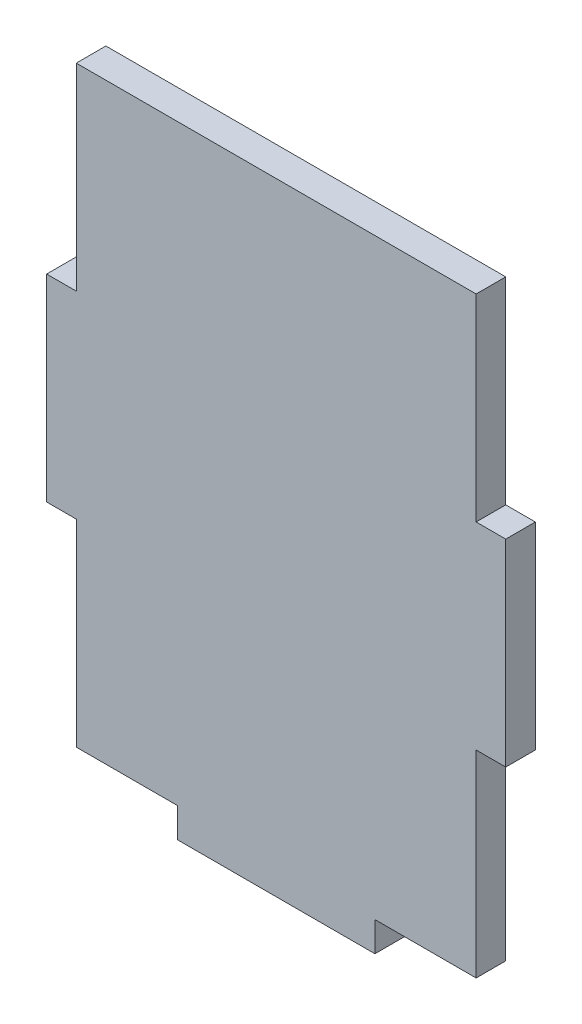
ISO-10303-21;
HEADER;
FILE_DESCRIPTION(('STEP AP214'),'2;1');
FILE_NAME('part.step','',(''),(''),'','','');
FILE_SCHEMA(('AUTOMOTIVE_DESIGN { 1 0 10303 214 1 1 1 1 }'));
ENDSEC;
DATA;
#1=APPLICATION_CONTEXT('core data for automotive mechanical design processes');
#2=APPLICATION_PROTOCOL_DEFINITION('international standard','automotive_design',2000,#1);
#3=PRODUCT_CONTEXT('',#1,'mechanical');
#4=PRODUCT('Part','Part','',(#3));
#5=PRODUCT_RELATED_PRODUCT_CATEGORY('part','',(#4));
#6=PRODUCT_DEFINITION_FORMATION('','',#4);
#7=PRODUCT_DEFINITION_CONTEXT('part definition',#1,'design');
#8=PRODUCT_DEFINITION('design','',#6,#7);
#9=PRODUCT_DEFINITION_SHAPE('','',#8);
#10=(LENGTH_UNIT() NAMED_UNIT(*) SI_UNIT(.MILLI.,.METRE.));
#11=(NAMED_UNIT(*) PLANE_ANGLE_UNIT() SI_UNIT($,.RADIAN.));
#12=(NAMED_UNIT(*) SI_UNIT($,.STERADIAN.) SOLID_ANGLE_UNIT());
#13=UNCERTAINTY_MEASURE_WITH_UNIT(LENGTH_MEASURE(1.E-05),#10,'distance_accuracy_value','');
#14=(GEOMETRIC_REPRESENTATION_CONTEXT(3) GLOBAL_UNCERTAINTY_ASSIGNED_CONTEXT((#13)) GLOBAL_UNIT_ASSIGNED_CONTEXT((#10,
#11,#12)) REPRESENTATION_CONTEXT('',''));
#15=CARTESIAN_POINT('',(0.,0.,0.));
#16=DIRECTION('',(0.,0.,1.));
#17=DIRECTION('',(1.,0.,0.));
#18=AXIS2_PLACEMENT_3D('',#15,#16,#17);
#19=CARTESIAN_POINT('',(0.,0.,3.));
#20=DIRECTION('',(-1.,0.,0.));
#21=DIRECTION('',(0.,0.,1.));
#22=AXIS2_PLACEMENT_3D('',#19,#20,#21);
#23=PLANE('',#22);
#24=DIRECTION('',(0.,0.,-1.));
#25=VECTOR('',#24,1.);
#26=CARTESIAN_POINT('',(0.,40.,3.));
#27=LINE('',#26,#25);
#28=CARTESIAN_POINT('',(0.,40.,3.));
#29=VERTEX_POINT('',#28);
#30=CARTESIAN_POINT('',(0.,40.,0.));
#31=VERTEX_POINT('',#30);
#32=EDGE_CURVE('E173',#29,#31,#27,.T.);
#33=ORIENTED_EDGE('',*,*,#32,.F.);
#34=DIRECTION('',(0.,1.,0.));
#35=VECTOR('',#34,1.);
#36=CARTESIAN_POINT('',(0.,0.,3.));
#37=LINE('',#36,#35);
#38=CARTESIAN_POINT('',(0.,60.,3.));
#39=VERTEX_POINT('',#38);
#40=EDGE_CURVE('E423',#29,#39,#37,.T.);
#41=ORIENTED_EDGE('',*,*,#40,.T.);
#42=DIRECTION('',(0.,0.,-1.));
#43=VECTOR('',#42,1.);
#44=CARTESIAN_POINT('',(0.,60.,3.));
#45=LINE('',#44,#43);
#46=CARTESIAN_POINT('',(0.,60.,0.));
#47=VERTEX_POINT('',#46);
#48=EDGE_CURVE('E254',#39,#47,#45,.T.);
#49=ORIENTED_EDGE('',*,*,#48,.T.);
#50=DIRECTION('',(0.,1.,0.));
#51=VECTOR('',#50,1.);
#52=CARTESIAN_POINT('',(0.,0.,0.));
#53=LINE('',#52,#51);
#54=EDGE_CURVE('E251',#31,#47,#53,.T.);
#55=ORIENTED_EDGE('',*,*,#54,.F.);
#56=EDGE_LOOP('',(#33,#41,#49,#55));
#57=FACE_BOUND('',#56,.T.);
#58=ADVANCED_FACE('F163',(#57),#23,.T.);
#59=CARTESIAN_POINT('',(0.,0.,3.));
#60=VERTEX_POINT('',#59);
#61=CARTESIAN_POINT('',(0.,20.,3.));
#62=VERTEX_POINT('',#61);
#63=EDGE_CURVE('E266',#60,#62,#37,.T.);
#64=ORIENTED_EDGE('',*,*,#63,.T.);
#65=DIRECTION('',(0.,0.,-1.));
#66=VECTOR('',#65,1.);
#67=CARTESIAN_POINT('',(0.,20.,3.));
#68=LINE('',#67,#66);
#69=CARTESIAN_POINT('',(0.,20.,0.));
#70=VERTEX_POINT('',#69);
#71=EDGE_CURVE('E12',#62,#70,#68,.T.);
#72=ORIENTED_EDGE('',*,*,#71,.T.);
#73=CARTESIAN_POINT('',(0.,0.,0.));
#74=VERTEX_POINT('',#73);
#75=EDGE_CURVE('E224',#74,#70,#53,.T.);
#76=ORIENTED_EDGE('',*,*,#75,.F.);
#77=DIRECTION('',(0.,0.,-1.));
#78=VECTOR('',#77,1.);
#79=CARTESIAN_POINT('',(0.,0.,3.));
#80=LINE('',#79,#78);
#81=EDGE_CURVE('E263',#60,#74,#80,.T.);
#82=ORIENTED_EDGE('',*,*,#81,.F.);
#83=EDGE_LOOP('',(#64,#72,#76,#82));
#84=FACE_BOUND('',#83,.T.);
#85=ADVANCED_FACE('F447',(#84),#23,.T.);
#86=CARTESIAN_POINT('',(40.5,0.,3.));
#87=DIRECTION('',(-1.,0.,0.));
#88=DIRECTION('',(0.,0.,1.));
#89=AXIS2_PLACEMENT_3D('',#86,#87,#88);
#90=PLANE('',#89);
#91=DIRECTION('',(0.,1.,0.));
#92=VECTOR('',#91,1.);
#93=CARTESIAN_POINT('',(40.5,0.,0.));
#94=LINE('',#93,#92);
#95=CARTESIAN_POINT('',(40.5,40.,0.));
#96=VERTEX_POINT('',#95);
#97=CARTESIAN_POINT('',(40.5,60.,0.));
#98=VERTEX_POINT('',#97);
#99=EDGE_CURVE('E259',#96,#98,#94,.T.);
#100=ORIENTED_EDGE('',*,*,#99,.T.);
#101=DIRECTION('',(0.,0.,-1.));
#102=VECTOR('',#101,1.);
#103=CARTESIAN_POINT('',(40.5,60.,3.));
#104=LINE('',#103,#102);
#105=CARTESIAN_POINT('',(40.5,60.,3.));
#106=VERTEX_POINT('',#105);
#107=EDGE_CURVE('E268',#106,#98,#104,.T.);
#108=ORIENTED_EDGE('',*,*,#107,.F.);
#109=DIRECTION('',(0.,1.,0.));
#110=VECTOR('',#109,1.);
#111=CARTESIAN_POINT('',(40.5,0.,3.));
#112=LINE('',#111,#110);
#113=CARTESIAN_POINT('',(40.5,40.,3.));
#114=VERTEX_POINT('',#113);
#115=EDGE_CURVE('E418',#114,#106,#112,.T.);
#116=ORIENTED_EDGE('',*,*,#115,.F.);
#117=DIRECTION('',(0.,0.,-1.));
#118=VECTOR('',#117,1.);
#119=CARTESIAN_POINT('',(40.5,40.,3.));
#120=LINE('',#119,#118);
#121=EDGE_CURVE('E271',#114,#96,#120,.T.);
#122=ORIENTED_EDGE('',*,*,#121,.T.);
#123=EDGE_LOOP('',(#100,#108,#116,#122));
#124=FACE_BOUND('',#123,.T.);
#125=ADVANCED_FACE('F339',(#124),#90,.F.);
#126=CARTESIAN_POINT('',(40.5,0.,0.));
#127=VERTEX_POINT('',#126);
#128=CARTESIAN_POINT('',(40.5,20.,0.));
#129=VERTEX_POINT('',#128);
#130=EDGE_CURVE('E318',#127,#129,#94,.T.);
#131=ORIENTED_EDGE('',*,*,#130,.T.);
#132=DIRECTION('',(0.,0.,-1.));
#133=VECTOR('',#132,1.);
#134=CARTESIAN_POINT('',(40.5,20.,3.));
#135=LINE('',#134,#133);
#136=CARTESIAN_POINT('',(40.5,20.,3.));
#137=VERTEX_POINT('',#136);
#138=EDGE_CURVE('E280',#137,#129,#135,.T.);
#139=ORIENTED_EDGE('',*,*,#138,.F.);
#140=CARTESIAN_POINT('',(40.5,0.,3.));
#141=VERTEX_POINT('',#140);
#142=EDGE_CURVE('E401',#141,#137,#112,.T.);
#143=ORIENTED_EDGE('',*,*,#142,.F.);
#144=DIRECTION('',(0.,0.,-1.));
#145=VECTOR('',#144,1.);
#146=CARTESIAN_POINT('',(40.5,0.,3.));
#147=LINE('',#146,#145);
#148=EDGE_CURVE('E283',#141,#127,#147,.T.);
#149=ORIENTED_EDGE('',*,*,#148,.T.);
#150=EDGE_LOOP('',(#131,#139,#143,#149));
#151=FACE_BOUND('',#150,.T.);
#152=ADVANCED_FACE('F398',(#151),#90,.F.);
#153=CARTESIAN_POINT('',(0.,0.,3.));
#154=DIRECTION('',(0.,1.,0.));
#155=DIRECTION('',(0.,0.,1.));
#156=AXIS2_PLACEMENT_3D('',#153,#154,#155);
#157=PLANE('',#156);
#158=DIRECTION('',(1.,0.,0.));
#159=VECTOR('',#158,1.);
#160=CARTESIAN_POINT('',(0.,0.,0.));
#161=LINE('',#160,#159);
#162=CARTESIAN_POINT('',(30.25,0.,0.));
#163=VERTEX_POINT('',#162);
#164=EDGE_CURVE('E316',#163,#127,#161,.T.);
#165=ORIENTED_EDGE('',*,*,#164,.T.);
#166=ORIENTED_EDGE('',*,*,#148,.F.);
#167=DIRECTION('',(1.,0.,0.));
#168=VECTOR('',#167,1.);
#169=CARTESIAN_POINT('',(0.,0.,3.));
#170=LINE('',#169,#168);
#171=CARTESIAN_POINT('',(30.25,0.,3.));
#172=VERTEX_POINT('',#171);
#173=EDGE_CURVE('E407',#172,#141,#170,.T.);
#174=ORIENTED_EDGE('',*,*,#173,.F.);
#175=DIRECTION('',(0.,0.,-1.));
#176=VECTOR('',#175,1.);
#177=CARTESIAN_POINT('',(30.25,0.,3.));
#178=LINE('',#177,#176);
#179=EDGE_CURVE('E286',#172,#163,#178,.T.);
#180=ORIENTED_EDGE('',*,*,#179,.T.);
#181=EDGE_LOOP('',(#165,#166,#174,#180));
#182=FACE_BOUND('',#181,.T.);
#183=ADVANCED_FACE('F404',(#182),#157,.F.);
#184=CARTESIAN_POINT('',(10.25,0.,0.));
#185=VERTEX_POINT('',#184);
#186=EDGE_CURVE('E320',#74,#185,#161,.T.);
#187=ORIENTED_EDGE('',*,*,#186,.T.);
#188=DIRECTION('',(0.,0.,-1.));
#189=VECTOR('',#188,1.);
#190=CARTESIAN_POINT('',(10.25,0.,3.));
#191=LINE('',#190,#189);
#192=CARTESIAN_POINT('',(10.25,0.,3.));
#193=VERTEX_POINT('',#192);
#194=EDGE_CURVE('E232',#193,#185,#191,.T.);
#195=ORIENTED_EDGE('',*,*,#194,.F.);
#196=EDGE_CURVE('E258',#60,#193,#170,.T.);
#197=ORIENTED_EDGE('',*,*,#196,.F.);
#198=ORIENTED_EDGE('',*,*,#81,.T.);
#199=EDGE_LOOP('',(#187,#195,#197,#198));
#200=FACE_BOUND('',#199,.T.);
#201=ADVANCED_FACE('F443',(#200),#157,.F.);
#202=CARTESIAN_POINT('',(0.,60.,3.));
#203=DIRECTION('',(0.,1.,0.));
#204=DIRECTION('',(0.,0.,1.));
#205=AXIS2_PLACEMENT_3D('',#202,#203,#204);
#206=PLANE('',#205);
#207=DIRECTION('',(1.,0.,0.));
#208=VECTOR('',#207,1.);
#209=CARTESIAN_POINT('',(0.,60.,0.));
#210=LINE('',#209,#208);
#211=EDGE_CURVE('E256',#47,#98,#210,.T.);
#212=ORIENTED_EDGE('',*,*,#211,.F.);
#213=ORIENTED_EDGE('',*,*,#48,.F.);
#214=DIRECTION('',(1.,0.,0.));
#215=VECTOR('',#214,1.);
#216=CARTESIAN_POINT('',(0.,60.,3.));
#217=LINE('',#216,#215);
#218=EDGE_CURVE('E421',#39,#106,#217,.T.);
#219=ORIENTED_EDGE('',*,*,#218,.T.);
#220=ORIENTED_EDGE('',*,*,#107,.T.);
#221=EDGE_LOOP('',(#212,#213,#219,#220));
#222=FACE_BOUND('',#221,.T.);
#223=ADVANCED_FACE('F347',(#222),#206,.T.);
#224=CARTESIAN_POINT('',(43.5,0.,3.));
#225=DIRECTION('',(1.,0.,0.));
#226=DIRECTION('',(0.,0.,-1.));
#227=AXIS2_PLACEMENT_3D('',#224,#225,#226);
#228=PLANE('',#227);
#229=DIRECTION('',(0.,-1.,0.));
#230=VECTOR('',#229,1.);
#231=CARTESIAN_POINT('',(43.5,0.,0.));
#232=LINE('',#231,#230);
#233=CARTESIAN_POINT('',(43.5,40.,0.));
#234=VERTEX_POINT('',#233);
#235=CARTESIAN_POINT('',(43.5,20.,0.));
#236=VERTEX_POINT('',#235);
#237=EDGE_CURVE('E328',#234,#236,#232,.T.);
#238=ORIENTED_EDGE('',*,*,#237,.F.);
#239=DIRECTION('',(0.,0.,-1.));
#240=VECTOR('',#239,1.);
#241=CARTESIAN_POINT('',(43.5,40.,3.));
#242=LINE('',#241,#240);
#243=CARTESIAN_POINT('',(43.5,40.,3.));
#244=VERTEX_POINT('',#243);
#245=EDGE_CURVE('E274',#244,#234,#242,.T.);
#246=ORIENTED_EDGE('',*,*,#245,.F.);
#247=DIRECTION('',(0.,-1.,0.));
#248=VECTOR('',#247,1.);
#249=CARTESIAN_POINT('',(43.5,0.,3.));
#250=LINE('',#249,#248);
#251=CARTESIAN_POINT('',(43.5,20.,3.));
#252=VERTEX_POINT('',#251);
#253=EDGE_CURVE('E425',#244,#252,#250,.T.);
#254=ORIENTED_EDGE('',*,*,#253,.T.);
#255=DIRECTION('',(0.,0.,-1.));
#256=VECTOR('',#255,1.);
#257=CARTESIAN_POINT('',(43.5,20.,3.));
#258=LINE('',#257,#256);
#259=EDGE_CURVE('E277',#252,#236,#258,.T.);
#260=ORIENTED_EDGE('',*,*,#259,.T.);
#261=EDGE_LOOP('',(#238,#246,#254,#260));
#262=FACE_BOUND('',#261,.T.);
#263=ADVANCED_FACE('F385',(#262),#228,.T.);
#264=CARTESIAN_POINT('',(0.,40.,3.));
#265=DIRECTION('',(0.,1.,0.));
#266=DIRECTION('',(0.,0.,1.));
#267=AXIS2_PLACEMENT_3D('',#264,#265,#266);
#268=PLANE('',#267);
#269=DIRECTION('',(1.,0.,0.));
#270=VECTOR('',#269,1.);
#271=CARTESIAN_POINT('',(0.,40.,0.));
#272=LINE('',#271,#270);
#273=EDGE_CURVE('E330',#96,#234,#272,.T.);
#274=ORIENTED_EDGE('',*,*,#273,.F.);
#275=ORIENTED_EDGE('',*,*,#121,.F.);
#276=DIRECTION('',(1.,0.,0.));
#277=VECTOR('',#276,1.);
#278=CARTESIAN_POINT('',(0.,40.,3.));
#279=LINE('',#278,#277);
#280=EDGE_CURVE('E381',#114,#244,#279,.T.);
#281=ORIENTED_EDGE('',*,*,#280,.T.);
#282=ORIENTED_EDGE('',*,*,#245,.T.);
#283=EDGE_LOOP('',(#274,#275,#281,#282));
#284=FACE_BOUND('',#283,.T.);
#285=ADVANCED_FACE('F378',(#284),#268,.T.);
#286=CARTESIAN_POINT('',(0.,20.,3.));
#287=DIRECTION('',(0.,1.,0.));
#288=DIRECTION('',(0.,0.,1.));
#289=AXIS2_PLACEMENT_3D('',#286,#287,#288);
#290=PLANE('',#289);
#291=DIRECTION('',(1.,0.,0.));
#292=VECTOR('',#291,1.);
#293=CARTESIAN_POINT('',(0.,20.,0.));
#294=LINE('',#293,#292);
#295=EDGE_CURVE('E325',#129,#236,#294,.T.);
#296=ORIENTED_EDGE('',*,*,#295,.T.);
#297=ORIENTED_EDGE('',*,*,#259,.F.);
#298=DIRECTION('',(1.,0.,0.));
#299=VECTOR('',#298,1.);
#300=CARTESIAN_POINT('',(0.,20.,3.));
#301=LINE('',#300,#299);
#302=EDGE_CURVE('E394',#137,#252,#301,.T.);
#303=ORIENTED_EDGE('',*,*,#302,.F.);
#304=ORIENTED_EDGE('',*,*,#138,.T.);
#305=EDGE_LOOP('',(#296,#297,#303,#304));
#306=FACE_BOUND('',#305,.T.);
#307=ADVANCED_FACE('F388',(#306),#290,.F.);
#308=CARTESIAN_POINT('',(0.,0.,0.));
#309=DIRECTION('',(0.,0.,1.));
#310=DIRECTION('',(1.,0.,0.));
#311=AXIS2_PLACEMENT_3D('',#308,#309,#310);
#312=PLANE('',#311);
#313=ORIENTED_EDGE('',*,*,#295,.F.);
#314=ORIENTED_EDGE('',*,*,#130,.F.);
#315=ORIENTED_EDGE('',*,*,#164,.F.);
#316=DIRECTION('',(0.,-1.,0.));
#317=VECTOR('',#316,1.);
#318=CARTESIAN_POINT('',(30.25,0.,0.));
#319=LINE('',#318,#317);
#320=CARTESIAN_POINT('',(30.25,-3.,0.));
#321=VERTEX_POINT('',#320);
#322=EDGE_CURVE('E299',#163,#321,#319,.T.);
#323=ORIENTED_EDGE('',*,*,#322,.T.);
#324=DIRECTION('',(1.,0.,0.));
#325=VECTOR('',#324,1.);
#326=CARTESIAN_POINT('',(0.,-3.,0.));
#327=LINE('',#326,#325);
#328=CARTESIAN_POINT('',(10.25,-3.,0.));
#329=VERTEX_POINT('',#328);
#330=EDGE_CURVE('E308',#329,#321,#327,.T.);
#331=ORIENTED_EDGE('',*,*,#330,.F.);
#332=DIRECTION('',(0.,-1.,0.));
#333=VECTOR('',#332,1.);
#334=CARTESIAN_POINT('',(10.25,0.,0.));
#335=LINE('',#334,#333);
#336=EDGE_CURVE('E311',#185,#329,#335,.T.);
#337=ORIENTED_EDGE('',*,*,#336,.F.);
#338=ORIENTED_EDGE('',*,*,#186,.F.);
#339=ORIENTED_EDGE('',*,*,#75,.T.);
#340=DIRECTION('',(-1.,0.,0.));
#341=VECTOR('',#340,1.);
#342=CARTESIAN_POINT('',(0.,20.,0.));
#343=LINE('',#342,#341);
#344=CARTESIAN_POINT('',(-3.,20.,0.));
#345=VERTEX_POINT('',#344);
#346=EDGE_CURVE('E210',#70,#345,#343,.T.);
#347=ORIENTED_EDGE('',*,*,#346,.T.);
#348=DIRECTION('',(0.,-1.,0.));
#349=VECTOR('',#348,1.);
#350=CARTESIAN_POINT('',(-3.,40.,0.));
#351=LINE('',#350,#349);
#352=CARTESIAN_POINT('',(-3.,40.,0.));
#353=VERTEX_POINT('',#352);
#354=EDGE_CURVE('E200',#353,#345,#351,.T.);
#355=ORIENTED_EDGE('',*,*,#354,.F.);
#356=DIRECTION('',(-1.,0.,0.));
#357=VECTOR('',#356,1.);
#358=CARTESIAN_POINT('',(0.,40.,0.));
#359=LINE('',#358,#357);
#360=EDGE_CURVE('E218',#31,#353,#359,.T.);
#361=ORIENTED_EDGE('',*,*,#360,.F.);
#362=ORIENTED_EDGE('',*,*,#54,.T.);
#363=ORIENTED_EDGE('',*,*,#211,.T.);
#364=ORIENTED_EDGE('',*,*,#99,.F.);
#365=ORIENTED_EDGE('',*,*,#273,.T.);
#366=ORIENTED_EDGE('',*,*,#237,.T.);
#367=EDGE_LOOP('',(#313,#314,#315,#323,#331,#337,#338,#339,#347,#355,#361,#362,#363,#364,#365,#366));
#368=FACE_BOUND('',#367,.T.);
#369=ADVANCED_FACE('F221',(#368),#312,.F.);
#370=CARTESIAN_POINT('',(0.,0.,3.));
#371=DIRECTION('',(0.,0.,1.));
#372=DIRECTION('',(1.,0.,0.));
#373=AXIS2_PLACEMENT_3D('',#370,#371,#372);
#374=PLANE('',#373);
#375=ORIENTED_EDGE('',*,*,#280,.F.);
#376=ORIENTED_EDGE('',*,*,#115,.T.);
#377=ORIENTED_EDGE('',*,*,#218,.F.);
#378=ORIENTED_EDGE('',*,*,#40,.F.);
#379=DIRECTION('',(-1.,0.,0.));
#380=VECTOR('',#379,1.);
#381=CARTESIAN_POINT('',(0.,40.,3.));
#382=LINE('',#381,#380);
#383=CARTESIAN_POINT('',(-3.,40.,3.));
#384=VERTEX_POINT('',#383);
#385=EDGE_CURVE('E225',#29,#384,#382,.T.);
#386=ORIENTED_EDGE('',*,*,#385,.T.);
#387=DIRECTION('',(0.,-1.,0.));
#388=VECTOR('',#387,1.);
#389=CARTESIAN_POINT('',(-3.,40.,3.));
#390=LINE('',#389,#388);
#391=CARTESIAN_POINT('',(-3.,20.,3.));
#392=VERTEX_POINT('',#391);
#393=EDGE_CURVE('E228',#384,#392,#390,.T.);
#394=ORIENTED_EDGE('',*,*,#393,.T.);
#395=DIRECTION('',(-1.,0.,0.));
#396=VECTOR('',#395,1.);
#397=CARTESIAN_POINT('',(0.,20.,3.));
#398=LINE('',#397,#396);
#399=EDGE_CURVE('E213',#62,#392,#398,.T.);
#400=ORIENTED_EDGE('',*,*,#399,.F.);
#401=ORIENTED_EDGE('',*,*,#63,.F.);
#402=ORIENTED_EDGE('',*,*,#196,.T.);
#403=DIRECTION('',(0.,-1.,0.));
#404=VECTOR('',#403,1.);
#405=CARTESIAN_POINT('',(10.25,0.,3.));
#406=LINE('',#405,#404);
#407=CARTESIAN_POINT('',(10.25,-3.,3.));
#408=VERTEX_POINT('',#407);
#409=EDGE_CURVE('E433',#193,#408,#406,.T.);
#410=ORIENTED_EDGE('',*,*,#409,.T.);
#411=DIRECTION('',(1.,0.,0.));
#412=VECTOR('',#411,1.);
#413=CARTESIAN_POINT('',(0.,-3.,3.));
#414=LINE('',#413,#412);
#415=CARTESIAN_POINT('',(30.25,-3.,3.));
#416=VERTEX_POINT('',#415);
#417=EDGE_CURVE('E430',#408,#416,#414,.T.);
#418=ORIENTED_EDGE('',*,*,#417,.T.);
#419=DIRECTION('',(0.,-1.,0.));
#420=VECTOR('',#419,1.);
#421=CARTESIAN_POINT('',(30.25,0.,3.));
#422=LINE('',#421,#420);
#423=EDGE_CURVE('E302',#172,#416,#422,.T.);
#424=ORIENTED_EDGE('',*,*,#423,.F.);
#425=ORIENTED_EDGE('',*,*,#173,.T.);
#426=ORIENTED_EDGE('',*,*,#142,.T.);
#427=ORIENTED_EDGE('',*,*,#302,.T.);
#428=ORIENTED_EDGE('',*,*,#253,.F.);
#429=EDGE_LOOP('',(#375,#376,#377,#378,#386,#394,#400,#401,#402,#410,#418,#424,#425,#426,#427,#428));
#430=FACE_BOUND('',#429,.T.);
#431=ADVANCED_FACE('F419',(#430),#374,.T.);
#432=CARTESIAN_POINT('',(-3.,40.,3.));
#433=DIRECTION('',(1.,0.,0.));
#434=DIRECTION('',(0.,1.,0.));
#435=AXIS2_PLACEMENT_3D('',#432,#433,#434);
#436=PLANE('',#435);
#437=ORIENTED_EDGE('',*,*,#354,.T.);
#438=DIRECTION('',(0.,0.,-1.));
#439=VECTOR('',#438,1.);
#440=CARTESIAN_POINT('',(-3.,20.,3.));
#441=LINE('',#440,#439);
#442=EDGE_CURVE('E207',#392,#345,#441,.T.);
#443=ORIENTED_EDGE('',*,*,#442,.F.);
#444=ORIENTED_EDGE('',*,*,#393,.F.);
#445=DIRECTION('',(0.,0.,-1.));
#446=VECTOR('',#445,1.);
#447=CARTESIAN_POINT('',(-3.,40.,3.));
#448=LINE('',#447,#446);
#449=EDGE_CURVE('E167',#384,#353,#448,.T.);
#450=ORIENTED_EDGE('',*,*,#449,.T.);
#451=EDGE_LOOP('',(#437,#443,#444,#450));
#452=FACE_BOUND('',#451,.T.);
#453=ADVANCED_FACE('F215',(#452),#436,.F.);
#454=CARTESIAN_POINT('',(0.,20.,3.));
#455=DIRECTION('',(0.,-1.,0.));
#456=DIRECTION('',(0.,0.,-1.));
#457=AXIS2_PLACEMENT_3D('',#454,#455,#456);
#458=PLANE('',#457);
#459=ORIENTED_EDGE('',*,*,#346,.F.);
#460=ORIENTED_EDGE('',*,*,#71,.F.);
#461=ORIENTED_EDGE('',*,*,#399,.T.);
#462=ORIENTED_EDGE('',*,*,#442,.T.);
#463=EDGE_LOOP('',(#459,#460,#461,#462));
#464=FACE_BOUND('',#463,.T.);
#465=ADVANCED_FACE('F208',(#464),#458,.T.);
#466=CARTESIAN_POINT('',(0.,40.,3.));
#467=DIRECTION('',(0.,-1.,0.));
#468=DIRECTION('',(0.,0.,-1.));
#469=AXIS2_PLACEMENT_3D('',#466,#467,#468);
#470=PLANE('',#469);
#471=ORIENTED_EDGE('',*,*,#360,.T.);
#472=ORIENTED_EDGE('',*,*,#449,.F.);
#473=ORIENTED_EDGE('',*,*,#385,.F.);
#474=ORIENTED_EDGE('',*,*,#32,.T.);
#475=EDGE_LOOP('',(#471,#472,#473,#474));
#476=FACE_BOUND('',#475,.T.);
#477=ADVANCED_FACE('F165',(#476),#470,.F.);
#478=CARTESIAN_POINT('',(0.,-3.,3.));
#479=DIRECTION('',(0.,1.,0.));
#480=DIRECTION('',(0.,0.,1.));
#481=AXIS2_PLACEMENT_3D('',#478,#479,#480);
#482=PLANE('',#481);
#483=ORIENTED_EDGE('',*,*,#330,.T.);
#484=DIRECTION('',(0.,0.,-1.));
#485=VECTOR('',#484,1.);
#486=CARTESIAN_POINT('',(30.25,-3.,3.));
#487=LINE('',#486,#485);
#488=EDGE_CURVE('E243',#416,#321,#487,.T.);
#489=ORIENTED_EDGE('',*,*,#488,.F.);
#490=ORIENTED_EDGE('',*,*,#417,.F.);
#491=DIRECTION('',(0.,0.,-1.));
#492=VECTOR('',#491,1.);
#493=CARTESIAN_POINT('',(10.25,-3.,3.));
#494=LINE('',#493,#492);
#495=EDGE_CURVE('E235',#408,#329,#494,.T.);
#496=ORIENTED_EDGE('',*,*,#495,.T.);
#497=EDGE_LOOP('',(#483,#489,#490,#496));
#498=FACE_BOUND('',#497,.T.);
#499=ADVANCED_FACE('F309',(#498),#482,.F.);
#500=CARTESIAN_POINT('',(30.25,0.,3.));
#501=DIRECTION('',(1.,0.,0.));
#502=DIRECTION('',(0.,0.,-1.));
#503=AXIS2_PLACEMENT_3D('',#500,#501,#502);
#504=PLANE('',#503);
#505=ORIENTED_EDGE('',*,*,#322,.F.);
#506=ORIENTED_EDGE('',*,*,#179,.F.);
#507=ORIENTED_EDGE('',*,*,#423,.T.);
#508=ORIENTED_EDGE('',*,*,#488,.T.);
#509=EDGE_LOOP('',(#505,#506,#507,#508));
#510=FACE_BOUND('',#509,.T.);
#511=ADVANCED_FACE('F295',(#510),#504,.T.);
#512=CARTESIAN_POINT('',(10.25,0.,3.));
#513=DIRECTION('',(1.,0.,0.));
#514=DIRECTION('',(0.,0.,-1.));
#515=AXIS2_PLACEMENT_3D('',#512,#513,#514);
#516=PLANE('',#515);
#517=ORIENTED_EDGE('',*,*,#336,.T.);
#518=ORIENTED_EDGE('',*,*,#495,.F.);
#519=ORIENTED_EDGE('',*,*,#409,.F.);
#520=ORIENTED_EDGE('',*,*,#194,.T.);
#521=EDGE_LOOP('',(#517,#518,#519,#520));
#522=FACE_BOUND('',#521,.T.);
#523=ADVANCED_FACE('F444',(#522),#516,.F.);
#524=CLOSED_SHELL('',(#58,#85,#125,#152,#183,#201,#223,#263,#285,#307,#369,#431,#453,#465,#477,
#499,#511,#523));
#525=MANIFOLD_SOLID_BREP('B2',#524);
#526=ADVANCED_BREP_SHAPE_REPRESENTATION('',(#18,#525),#14);
#527=SHAPE_DEFINITION_REPRESENTATION(#9,#526);
ENDSEC;
END-ISO-10303-21;
